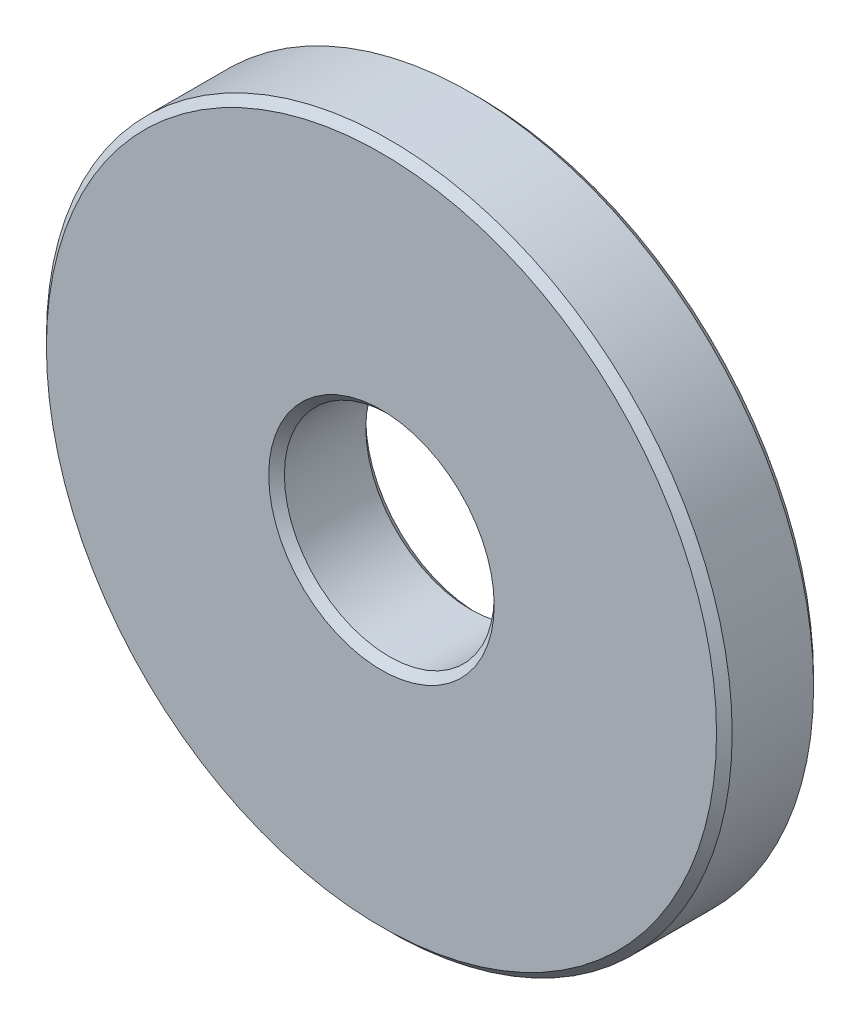
ISO-10303-21;
HEADER;
FILE_DESCRIPTION(('STEP AP214'),'2;1');
FILE_NAME('part.step','',(''),(''),'','','');
FILE_SCHEMA(('AUTOMOTIVE_DESIGN { 1 0 10303 214 1 1 1 1 }'));
ENDSEC;
DATA;
#1=APPLICATION_CONTEXT('core data for automotive mechanical design processes');
#2=APPLICATION_PROTOCOL_DEFINITION('international standard','automotive_design',2000,#1);
#3=PRODUCT_CONTEXT('',#1,'mechanical');
#4=PRODUCT('Part','Part','',(#3));
#5=PRODUCT_RELATED_PRODUCT_CATEGORY('part','',(#4));
#6=PRODUCT_DEFINITION_FORMATION('','',#4);
#7=PRODUCT_DEFINITION_CONTEXT('part definition',#1,'design');
#8=PRODUCT_DEFINITION('design','',#6,#7);
#9=PRODUCT_DEFINITION_SHAPE('','',#8);
#10=(LENGTH_UNIT() NAMED_UNIT(*) SI_UNIT(.MILLI.,.METRE.));
#11=(NAMED_UNIT(*) PLANE_ANGLE_UNIT() SI_UNIT($,.RADIAN.));
#12=(NAMED_UNIT(*) SI_UNIT($,.STERADIAN.) SOLID_ANGLE_UNIT());
#13=UNCERTAINTY_MEASURE_WITH_UNIT(LENGTH_MEASURE(1.E-05),#10,'distance_accuracy_value','');
#14=(GEOMETRIC_REPRESENTATION_CONTEXT(3) GLOBAL_UNCERTAINTY_ASSIGNED_CONTEXT((#13)) GLOBAL_UNIT_ASSIGNED_CONTEXT((#10,
#11,#12)) REPRESENTATION_CONTEXT('',''));
#15=CARTESIAN_POINT('',(0.,0.,0.));
#16=DIRECTION('',(0.,0.,1.));
#17=DIRECTION('',(1.,0.,0.));
#18=AXIS2_PLACEMENT_3D('',#15,#16,#17);
#19=CARTESIAN_POINT('',(0.,0.,3.1));
#20=DIRECTION('',(0.,0.,1.));
#21=DIRECTION('',(1.,0.,0.));
#22=AXIS2_PLACEMENT_3D('',#19,#20,#21);
#23=PLANE('',#22);
#24=CARTESIAN_POINT('',(0.,0.,3.1));
#25=DIRECTION('',(0.,0.,1.));
#26=DIRECTION('',(1.,0.,0.));
#27=AXIS2_PLACEMENT_3D('',#24,#25,#26);
#28=CIRCLE('',#27,3.60000000000001);
#29=CARTESIAN_POINT('',(3.60000000000001,0.,3.1));
#30=VERTEX_POINT('',#29);
#31=EDGE_CURVE('E64',#30,#30,#28,.F.);
#32=ORIENTED_EDGE('',*,*,#31,.T.);
#33=EDGE_LOOP('',(#32));
#34=FACE_BOUND('',#33,.T.);
#35=CARTESIAN_POINT('',(0.,0.,3.1));
#36=DIRECTION('',(0.,0.,1.));
#37=DIRECTION('',(1.,0.,0.));
#38=AXIS2_PLACEMENT_3D('',#35,#36,#37);
#39=CIRCLE('',#38,10.7);
#40=CARTESIAN_POINT('',(10.7,0.,3.1));
#41=VERTEX_POINT('',#40);
#42=EDGE_CURVE('E68',#41,#41,#39,.T.);
#43=ORIENTED_EDGE('',*,*,#42,.T.);
#44=EDGE_LOOP('',(#43));
#45=FACE_BOUND('',#44,.T.);
#46=ADVANCED_FACE('F39',(#34,#45),#23,.T.);
#47=CARTESIAN_POINT('',(0.,0.,0.));
#48=DIRECTION('',(0.,0.,1.));
#49=DIRECTION('',(1.,0.,0.));
#50=AXIS2_PLACEMENT_3D('',#47,#48,#49);
#51=PLANE('',#50);
#52=CARTESIAN_POINT('',(0.,0.,0.));
#53=DIRECTION('',(0.,0.,1.));
#54=DIRECTION('',(1.,0.,0.));
#55=AXIS2_PLACEMENT_3D('',#52,#53,#54);
#56=CIRCLE('',#55,3.59999999999999);
#57=CARTESIAN_POINT('',(3.59999999999999,0.,0.));
#58=VERTEX_POINT('',#57);
#59=EDGE_CURVE('E10',#58,#58,#56,.T.);
#60=ORIENTED_EDGE('',*,*,#59,.T.);
#61=EDGE_LOOP('',(#60));
#62=FACE_BOUND('',#61,.T.);
#63=CARTESIAN_POINT('',(0.,0.,0.));
#64=DIRECTION('',(0.,0.,1.));
#65=DIRECTION('',(1.,0.,0.));
#66=AXIS2_PLACEMENT_3D('',#63,#64,#65);
#67=CIRCLE('',#66,10.7);
#68=CARTESIAN_POINT('',(10.7,0.,0.));
#69=VERTEX_POINT('',#68);
#70=EDGE_CURVE('E48',#69,#69,#67,.F.);
#71=ORIENTED_EDGE('',*,*,#70,.T.);
#72=EDGE_LOOP('',(#71));
#73=FACE_BOUND('',#72,.T.);
#74=ADVANCED_FACE('F97',(#62,#73),#51,.F.);
#75=CARTESIAN_POINT('',(0.,0.,3.1));
#76=DIRECTION('',(0.,0.,-1.));
#77=DIRECTION('',(-1.,0.,0.));
#78=AXIS2_PLACEMENT_3D('',#75,#76,#77);
#79=CYLINDRICAL_SURFACE('',#78,10.95);
#80=CARTESIAN_POINT('',(0.,0.,2.85000000000001));
#81=DIRECTION('',(0.,0.,1.));
#82=DIRECTION('',(1.,0.,0.));
#83=AXIS2_PLACEMENT_3D('',#80,#81,#82);
#84=CIRCLE('',#83,10.95);
#85=CARTESIAN_POINT('',(-10.95,0.,2.85000000000001));
#86=VERTEX_POINT('',#85);
#87=EDGE_CURVE('E53',#86,#86,#84,.F.);
#88=CARTESIAN_POINT('',(0.,0.,0.250000000000012));
#89=DIRECTION('',(0.,0.,1.));
#90=DIRECTION('',(1.,0.,0.));
#91=AXIS2_PLACEMENT_3D('',#88,#89,#90);
#92=CIRCLE('',#91,10.95);
#93=CARTESIAN_POINT('',(-10.95,0.,0.250000000000012));
#94=VERTEX_POINT('',#93);
#95=EDGE_CURVE('E58',#94,#94,#92,.T.);
#96=CARTESIAN_POINT('',(-10.95,0.,2.85000000000001));
#97=CARTESIAN_POINT('',(-10.95,0.,2.82291666666668));
#98=CARTESIAN_POINT('',(-10.95,0.,2.79583333333334));
#99=CARTESIAN_POINT('',(-10.95,0.,2.74166666666668));
#100=CARTESIAN_POINT('',(-10.95,0.,2.71458333333334));
#101=CARTESIAN_POINT('',(-10.95,0.,2.66041666666668));
#102=CARTESIAN_POINT('',(-10.95,0.,2.63333333333334));
#103=CARTESIAN_POINT('',(-10.95,0.,2.57916666666668));
#104=CARTESIAN_POINT('',(-10.95,0.,2.55208333333334));
#105=CARTESIAN_POINT('',(-10.95,0.,2.49791666666668));
#106=CARTESIAN_POINT('',(-10.95,0.,2.47083333333334));
#107=CARTESIAN_POINT('',(-10.95,0.,2.41666666666668));
#108=CARTESIAN_POINT('',(-10.95,0.,2.38958333333334));
#109=CARTESIAN_POINT('',(-10.95,0.,2.33541666666668));
#110=CARTESIAN_POINT('',(-10.95,0.,2.30833333333334));
#111=CARTESIAN_POINT('',(-10.95,0.,2.25416666666668));
#112=CARTESIAN_POINT('',(-10.95,0.,2.22708333333334));
#113=CARTESIAN_POINT('',(-10.95,0.,2.17291666666668));
#114=CARTESIAN_POINT('',(-10.95,0.,2.14583333333334));
#115=CARTESIAN_POINT('',(-10.95,0.,2.09166666666668));
#116=CARTESIAN_POINT('',(-10.95,0.,2.06458333333334));
#117=CARTESIAN_POINT('',(-10.95,0.,2.01041666666668));
#118=CARTESIAN_POINT('',(-10.95,0.,1.98333333333334));
#119=CARTESIAN_POINT('',(-10.95,0.,1.92916666666668));
#120=CARTESIAN_POINT('',(-10.95,0.,1.90208333333334));
#121=CARTESIAN_POINT('',(-10.95,0.,1.84791666666668));
#122=CARTESIAN_POINT('',(-10.95,0.,1.82083333333334));
#123=CARTESIAN_POINT('',(-10.95,0.,1.76666666666668));
#124=CARTESIAN_POINT('',(-10.95,0.,1.73958333333334));
#125=CARTESIAN_POINT('',(-10.95,0.,1.68541666666668));
#126=CARTESIAN_POINT('',(-10.95,0.,1.65833333333334));
#127=CARTESIAN_POINT('',(-10.95,0.,1.60416666666668));
#128=CARTESIAN_POINT('',(-10.95,0.,1.57708333333334));
#129=CARTESIAN_POINT('',(-10.95,0.,1.52291666666668));
#130=CARTESIAN_POINT('',(-10.95,0.,1.49583333333334));
#131=CARTESIAN_POINT('',(-10.95,0.,1.44166666666668));
#132=CARTESIAN_POINT('',(-10.95,0.,1.41458333333334));
#133=CARTESIAN_POINT('',(-10.95,0.,1.36041666666668));
#134=CARTESIAN_POINT('',(-10.95,0.,1.33333333333334));
#135=CARTESIAN_POINT('',(-10.95,0.,1.27916666666668));
#136=CARTESIAN_POINT('',(-10.95,0.,1.25208333333334));
#137=CARTESIAN_POINT('',(-10.95,0.,1.19791666666668));
#138=CARTESIAN_POINT('',(-10.95,0.,1.17083333333334));
#139=CARTESIAN_POINT('',(-10.95,0.,1.11666666666668));
#140=CARTESIAN_POINT('',(-10.95,0.,1.08958333333334));
#141=CARTESIAN_POINT('',(-10.95,0.,1.03541666666668));
#142=CARTESIAN_POINT('',(-10.95,0.,1.00833333333334));
#143=CARTESIAN_POINT('',(-10.95,0.,0.954166666666678));
#144=CARTESIAN_POINT('',(-10.95,0.,0.927083333333345));
#145=CARTESIAN_POINT('',(-10.95,0.,0.872916666666679));
#146=CARTESIAN_POINT('',(-10.95,0.,0.845833333333345));
#147=CARTESIAN_POINT('',(-10.95,0.,0.791666666666679));
#148=CARTESIAN_POINT('',(-10.95,0.,0.764583333333345));
#149=CARTESIAN_POINT('',(-10.95,0.,0.710416666666678));
#150=CARTESIAN_POINT('',(-10.95,0.,0.683333333333345));
#151=CARTESIAN_POINT('',(-10.95,0.,0.629166666666679));
#152=CARTESIAN_POINT('',(-10.95,0.,0.602083333333345));
#153=CARTESIAN_POINT('',(-10.95,0.,0.547916666666679));
#154=CARTESIAN_POINT('',(-10.95,0.,0.520833333333346));
#155=CARTESIAN_POINT('',(-10.95,0.,0.466666666666679));
#156=CARTESIAN_POINT('',(-10.95,0.,0.439583333333345));
#157=CARTESIAN_POINT('',(-10.95,0.,0.385416666666679));
#158=CARTESIAN_POINT('',(-10.95,0.,0.358333333333345));
#159=CARTESIAN_POINT('',(-10.95,0.,0.304166666666679));
#160=CARTESIAN_POINT('',(-10.95,0.,0.277083333333346));
#161=CARTESIAN_POINT('',(-10.95,0.,0.250000000000012));
#162=B_SPLINE_CURVE_WITH_KNOTS('',3,(#96,#97,#98,#99,#100,#101,#102,#103,#104,#105,#106,#107,
#108,#109,#110,#111,#112,#113,#114,#115,#116,#117,#118,#119,#120,#121,#122,#123,#124,#125,#126,
#127,#128,#129,#130,#131,#132,#133,#134,#135,#136,#137,#138,#139,#140,#141,#142,#143,#144,#145,
#146,#147,#148,#149,#150,#151,#152,#153,#154,#155,#156,#157,#158,#159,#160,#161),.UNSPECIFIED.,
.F.,.F.,(4,2,2,2,2,2,2,2,2,2,2,2,2,2,2,2,2,2,2,2,2,2,2,2,2,2,2,2,2,2,2,2,4),(0.,
0.0812500000000002,0.1625,0.24375,0.325,0.40625,0.4875,0.56875,0.65,0.73125,0.812499999999999,
0.893749999999999,0.974999999999999,1.05625,1.1375,1.21875,1.3,1.38125,1.4625,1.54375,1.625,
1.70625,1.7875,1.86875,1.95,2.03125,2.1125,2.19375,2.275,2.35625,2.4375,2.51875,2.6),.UNSPECIFIED.);
#163=EDGE_CURVE('BSEAM103',#86,#94,#162,.T.);
#164=ORIENTED_EDGE('',*,*,#87,.T.);
#165=ORIENTED_EDGE('',*,*,#95,.T.);
#166=ORIENTED_EDGE('',*,*,#163,.T.);
#167=ORIENTED_EDGE('',*,*,#163,.F.);
#168=EDGE_LOOP('',(#164,#166,#165,#167));
#169=FACE_BOUND('',#168,.T.);
#170=ADVANCED_FACE('F103',(#169),#79,.T.);
#171=CARTESIAN_POINT('',(0.,0.,3.1));
#172=DIRECTION('',(0.,0.,-1.));
#173=DIRECTION('',(-1.,0.,0.));
#174=AXIS2_PLACEMENT_3D('',#171,#172,#173);
#175=CYLINDRICAL_SURFACE('',#174,3.35);
#176=CARTESIAN_POINT('',(0.,0.,2.84999999999999));
#177=DIRECTION('',(0.,0.,1.));
#178=DIRECTION('',(1.,0.,0.));
#179=AXIS2_PLACEMENT_3D('',#176,#177,#178);
#180=CIRCLE('',#179,3.35);
#181=CARTESIAN_POINT('',(-3.35,0.,2.84999999999999));
#182=VERTEX_POINT('',#181);
#183=EDGE_CURVE('E72',#182,#182,#180,.T.);
#184=CARTESIAN_POINT('',(0.,0.,0.24999999999999));
#185=DIRECTION('',(0.,0.,1.));
#186=DIRECTION('',(1.,0.,0.));
#187=AXIS2_PLACEMENT_3D('',#184,#185,#186);
#188=CIRCLE('',#187,3.35);
#189=CARTESIAN_POINT('',(-3.35,0.,0.24999999999999));
#190=VERTEX_POINT('',#189);
#191=EDGE_CURVE('E76',#190,#190,#188,.F.);
#192=CARTESIAN_POINT('',(-3.35,0.,2.84999999999999));
#193=CARTESIAN_POINT('',(-3.35,0.,2.82291666666666));
#194=CARTESIAN_POINT('',(-3.35,0.,2.79583333333332));
#195=CARTESIAN_POINT('',(-3.35,0.,2.74166666666666));
#196=CARTESIAN_POINT('',(-3.35,0.,2.71458333333332));
#197=CARTESIAN_POINT('',(-3.35,0.,2.66041666666666));
#198=CARTESIAN_POINT('',(-3.35,0.,2.63333333333332));
#199=CARTESIAN_POINT('',(-3.35,0.,2.57916666666666));
#200=CARTESIAN_POINT('',(-3.35,0.,2.55208333333332));
#201=CARTESIAN_POINT('',(-3.35,0.,2.49791666666666));
#202=CARTESIAN_POINT('',(-3.35,0.,2.47083333333332));
#203=CARTESIAN_POINT('',(-3.35,0.,2.41666666666666));
#204=CARTESIAN_POINT('',(-3.35,0.,2.38958333333332));
#205=CARTESIAN_POINT('',(-3.35,0.,2.33541666666666));
#206=CARTESIAN_POINT('',(-3.35,0.,2.30833333333332));
#207=CARTESIAN_POINT('',(-3.35,0.,2.25416666666666));
#208=CARTESIAN_POINT('',(-3.35,0.,2.22708333333332));
#209=CARTESIAN_POINT('',(-3.35,0.,2.17291666666666));
#210=CARTESIAN_POINT('',(-3.35,0.,2.14583333333332));
#211=CARTESIAN_POINT('',(-3.35,0.,2.09166666666666));
#212=CARTESIAN_POINT('',(-3.35,0.,2.06458333333332));
#213=CARTESIAN_POINT('',(-3.35,0.,2.01041666666666));
#214=CARTESIAN_POINT('',(-3.35,0.,1.98333333333332));
#215=CARTESIAN_POINT('',(-3.35,0.,1.92916666666666));
#216=CARTESIAN_POINT('',(-3.35,0.,1.90208333333332));
#217=CARTESIAN_POINT('',(-3.35,0.,1.84791666666666));
#218=CARTESIAN_POINT('',(-3.35,0.,1.82083333333332));
#219=CARTESIAN_POINT('',(-3.35,0.,1.76666666666666));
#220=CARTESIAN_POINT('',(-3.35,0.,1.73958333333332));
#221=CARTESIAN_POINT('',(-3.35,0.,1.68541666666666));
#222=CARTESIAN_POINT('',(-3.35,0.,1.65833333333332));
#223=CARTESIAN_POINT('',(-3.35,0.,1.60416666666666));
#224=CARTESIAN_POINT('',(-3.35,0.,1.57708333333332));
#225=CARTESIAN_POINT('',(-3.35,0.,1.52291666666666));
#226=CARTESIAN_POINT('',(-3.35,0.,1.49583333333332));
#227=CARTESIAN_POINT('',(-3.35,0.,1.44166666666666));
#228=CARTESIAN_POINT('',(-3.35,0.,1.41458333333332));
#229=CARTESIAN_POINT('',(-3.35,0.,1.36041666666666));
#230=CARTESIAN_POINT('',(-3.35,0.,1.33333333333332));
#231=CARTESIAN_POINT('',(-3.35,0.,1.27916666666666));
#232=CARTESIAN_POINT('',(-3.35,0.,1.25208333333332));
#233=CARTESIAN_POINT('',(-3.35,0.,1.19791666666666));
#234=CARTESIAN_POINT('',(-3.35,0.,1.17083333333332));
#235=CARTESIAN_POINT('',(-3.35,0.,1.11666666666666));
#236=CARTESIAN_POINT('',(-3.35,0.,1.08958333333332));
#237=CARTESIAN_POINT('',(-3.35,0.,1.03541666666666));
#238=CARTESIAN_POINT('',(-3.35,0.,1.00833333333332));
#239=CARTESIAN_POINT('',(-3.35,0.,0.954166666666657));
#240=CARTESIAN_POINT('',(-3.35,0.,0.927083333333323));
#241=CARTESIAN_POINT('',(-3.35,0.,0.872916666666656));
#242=CARTESIAN_POINT('',(-3.35,0.,0.845833333333323));
#243=CARTESIAN_POINT('',(-3.35,0.,0.791666666666656));
#244=CARTESIAN_POINT('',(-3.35,0.,0.764583333333323));
#245=CARTESIAN_POINT('',(-3.35,0.,0.710416666666656));
#246=CARTESIAN_POINT('',(-3.35,0.,0.683333333333323));
#247=CARTESIAN_POINT('',(-3.35,0.,0.629166666666656));
#248=CARTESIAN_POINT('',(-3.35,0.,0.602083333333323));
#249=CARTESIAN_POINT('',(-3.35,0.,0.547916666666656));
#250=CARTESIAN_POINT('',(-3.35,0.,0.520833333333323));
#251=CARTESIAN_POINT('',(-3.35,0.,0.466666666666656));
#252=CARTESIAN_POINT('',(-3.35,0.,0.439583333333323));
#253=CARTESIAN_POINT('',(-3.35,0.,0.385416666666656));
#254=CARTESIAN_POINT('',(-3.35,0.,0.358333333333323));
#255=CARTESIAN_POINT('',(-3.35,0.,0.304166666666656));
#256=CARTESIAN_POINT('',(-3.35,0.,0.277083333333323));
#257=CARTESIAN_POINT('',(-3.35,0.,0.24999999999999));
#258=B_SPLINE_CURVE_WITH_KNOTS('',3,(#192,#193,#194,#195,#196,#197,#198,#199,#200,#201,#202,
#203,#204,#205,#206,#207,#208,#209,#210,#211,#212,#213,#214,#215,#216,#217,#218,#219,#220,#221,
#222,#223,#224,#225,#226,#227,#228,#229,#230,#231,#232,#233,#234,#235,#236,#237,#238,#239,#240,
#241,#242,#243,#244,#245,#246,#247,#248,#249,#250,#251,#252,#253,#254,#255,#256,#257),
.UNSPECIFIED.,.F.,.F.,(4,2,2,2,2,2,2,2,2,2,2,2,2,2,2,2,2,2,2,2,2,2,2,2,2,2,2,2,2,2,2,2,4),(0.,
0.0812500000000002,0.1625,0.24375,0.325,0.40625,0.4875,0.56875,0.65,0.731250000000001,0.8125,
0.89375,0.975,1.05625,1.1375,1.21875,1.3,1.38125,1.4625,1.54375,1.625,1.70625,1.7875,1.86875,
1.95,2.03125,2.1125,2.19375,2.275,2.35625,2.4375,2.51875,2.6),.UNSPECIFIED.);
#259=EDGE_CURVE('BSEAM81',#182,#190,#258,.T.);
#260=ORIENTED_EDGE('',*,*,#183,.T.);
#261=ORIENTED_EDGE('',*,*,#191,.T.);
#262=ORIENTED_EDGE('',*,*,#259,.T.);
#263=ORIENTED_EDGE('',*,*,#259,.F.);
#264=EDGE_LOOP('',(#260,#262,#261,#263));
#265=FACE_BOUND('',#264,.T.);
#266=ADVANCED_FACE('F81',(#265),#175,.F.);
#267=CARTESIAN_POINT('',(0.,0.,2.84999999999999));
#268=DIRECTION('',(0.,0.,1.));
#269=DIRECTION('',(1.,0.,0.));
#270=AXIS2_PLACEMENT_3D('',#267,#268,#269);
#271=CONICAL_SURFACE('',#270,3.35,0.785398163397453);
#272=ORIENTED_EDGE('',*,*,#31,.F.);
#273=EDGE_LOOP('',(#272));
#274=FACE_BOUND('',#273,.T.);
#275=ORIENTED_EDGE('',*,*,#183,.F.);
#276=EDGE_LOOP('',(#275));
#277=FACE_BOUND('',#276,.T.);
#278=ADVANCED_FACE('F92',(#274,#277),#271,.F.);
#279=CARTESIAN_POINT('',(0.,0.,3.1));
#280=DIRECTION('',(0.,0.,-1.));
#281=DIRECTION('',(-1.,0.,0.));
#282=AXIS2_PLACEMENT_3D('',#279,#280,#281);
#283=CONICAL_SURFACE('',#282,10.7,0.785398163397441);
#284=ORIENTED_EDGE('',*,*,#87,.F.);
#285=EDGE_LOOP('',(#284));
#286=FACE_BOUND('',#285,.T.);
#287=ORIENTED_EDGE('',*,*,#42,.F.);
#288=EDGE_LOOP('',(#287));
#289=FACE_BOUND('',#288,.T.);
#290=ADVANCED_FACE('F86',(#286,#289),#283,.T.);
#291=CARTESIAN_POINT('',(0.,0.,0.));
#292=DIRECTION('',(0.,0.,-1.));
#293=DIRECTION('',(-1.,0.,0.));
#294=AXIS2_PLACEMENT_3D('',#291,#292,#293);
#295=CONICAL_SURFACE('',#294,3.59999999999999,0.78539816339745);
#296=ORIENTED_EDGE('',*,*,#191,.F.);
#297=EDGE_LOOP('',(#296));
#298=FACE_BOUND('',#297,.T.);
#299=ORIENTED_EDGE('',*,*,#59,.F.);
#300=EDGE_LOOP('',(#299));
#301=FACE_BOUND('',#300,.T.);
#302=ADVANCED_FACE('F83',(#298,#301),#295,.F.);
#303=CARTESIAN_POINT('',(0.,0.,0.250000000000012));
#304=DIRECTION('',(0.,0.,1.));
#305=DIRECTION('',(1.,0.,0.));
#306=AXIS2_PLACEMENT_3D('',#303,#304,#305);
#307=CONICAL_SURFACE('',#306,10.95,0.785398163397448);
#308=ORIENTED_EDGE('',*,*,#70,.F.);
#309=EDGE_LOOP('',(#308));
#310=FACE_BOUND('',#309,.T.);
#311=ORIENTED_EDGE('',*,*,#95,.F.);
#312=EDGE_LOOP('',(#311));
#313=FACE_BOUND('',#312,.T.);
#314=ADVANCED_FACE('F42',(#310,#313),#307,.T.);
#315=CLOSED_SHELL('',(#46,#74,#170,#266,#278,#290,#302,#314));
#316=MANIFOLD_SOLID_BREP('B2',#315);
#317=ADVANCED_BREP_SHAPE_REPRESENTATION('',(#18,#316),#14);
#318=SHAPE_DEFINITION_REPRESENTATION(#9,#317);
ENDSEC;
END-ISO-10303-21;
